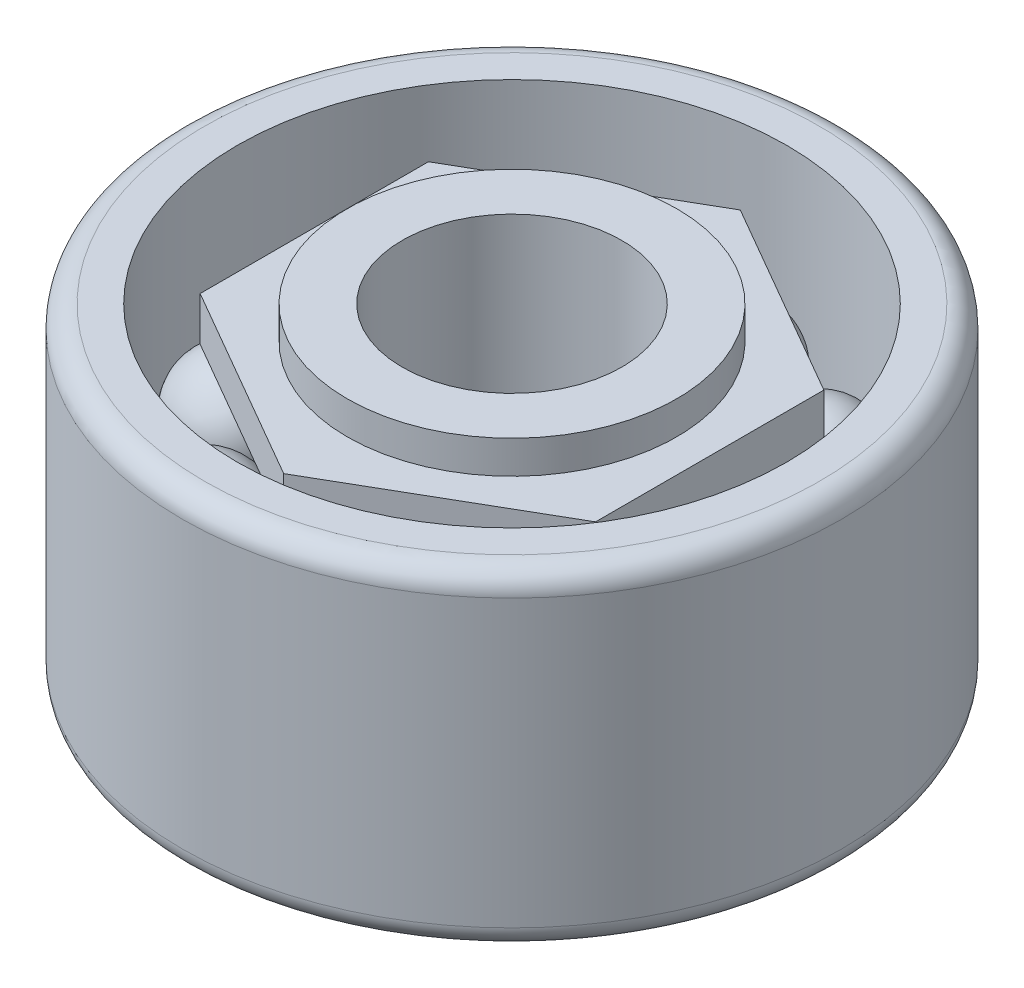
ISO-10303-21;
HEADER;
FILE_DESCRIPTION(('STEP AP214'),'2;1');
FILE_NAME('part.step','',(''),(''),'','','');
FILE_SCHEMA(('AUTOMOTIVE_DESIGN { 1 0 10303 214 1 1 1 1 }'));
ENDSEC;
DATA;
#1=APPLICATION_CONTEXT('core data for automotive mechanical design processes');
#2=APPLICATION_PROTOCOL_DEFINITION('international standard','automotive_design',2000,#1);
#3=PRODUCT_CONTEXT('',#1,'mechanical');
#4=PRODUCT('Part','Part','',(#3));
#5=PRODUCT_RELATED_PRODUCT_CATEGORY('part','',(#4));
#6=PRODUCT_DEFINITION_FORMATION('','',#4);
#7=PRODUCT_DEFINITION_CONTEXT('part definition',#1,'design');
#8=PRODUCT_DEFINITION('design','',#6,#7);
#9=PRODUCT_DEFINITION_SHAPE('','',#8);
#10=(LENGTH_UNIT() NAMED_UNIT(*) SI_UNIT(.MILLI.,.METRE.));
#11=(NAMED_UNIT(*) PLANE_ANGLE_UNIT() SI_UNIT($,.RADIAN.));
#12=(NAMED_UNIT(*) SI_UNIT($,.STERADIAN.) SOLID_ANGLE_UNIT());
#13=UNCERTAINTY_MEASURE_WITH_UNIT(LENGTH_MEASURE(1.E-05),#10,'distance_accuracy_value','');
#14=(GEOMETRIC_REPRESENTATION_CONTEXT(3) GLOBAL_UNCERTAINTY_ASSIGNED_CONTEXT((#13)) GLOBAL_UNIT_ASSIGNED_CONTEXT((#10,
#11,#12)) REPRESENTATION_CONTEXT('',''));
#15=CARTESIAN_POINT('',(0.,0.,0.));
#16=DIRECTION('',(0.,0.,1.));
#17=DIRECTION('',(1.,0.,0.));
#18=AXIS2_PLACEMENT_3D('',#15,#16,#17);
#19=CARTESIAN_POINT('',(-0.587785252292471,0.,-0.809016994374967));
#20=DIRECTION('',(0.587785252292462,0.,0.809016994374955));
#21=DIRECTION('',(0.,1.,0.));
#22=AXIS2_PLACEMENT_3D('',#19,#20,#21);
#23=SPHERICAL_SURFACE('',#22,0.249999999999986);
#24=CARTESIAN_POINT('',(-0.440838939219364,0.,-0.606762745781239));
#25=VERTEX_POINT('',#24);
#26=VERTEX_LOOP('',#25);
#27=FACE_BOUND('',#26,.T.);
#28=ADVANCED_FACE('F47',(#27),#23,.T.);
#29=CLOSED_SHELL('',(#28));
#30=MANIFOLD_SOLID_BREP('B2',#29);
#31=CARTESIAN_POINT('',(-0.951056516295164,0.,-0.309016994374963));
#32=DIRECTION('',(0.95105651629515,0.,0.309016994374958));
#33=DIRECTION('',(0.,1.,0.));
#34=AXIS2_PLACEMENT_3D('',#31,#32,#33);
#35=SPHERICAL_SURFACE('',#34,0.249999999999986);
#36=CARTESIAN_POINT('',(-0.71329238722139,0.,-0.231762745781227));
#37=VERTEX_POINT('',#36);
#38=VERTEX_LOOP('',#37);
#39=FACE_BOUND('',#38,.T.);
#40=ADVANCED_FACE('F65',(#39),#35,.T.);
#41=CLOSED_SHELL('',(#40));
#42=MANIFOLD_SOLID_BREP('B7',#41);
#43=CARTESIAN_POINT('',(-0.95105651629517,0.,0.309016994374943));
#44=DIRECTION('',(0.951056516295157,0.,-0.309016994374938));
#45=DIRECTION('',(0.,1.,0.));
#46=AXIS2_PLACEMENT_3D('',#43,#44,#45);
#47=SPHERICAL_SURFACE('',#46,0.249999999999986);
#48=CARTESIAN_POINT('',(-0.713292387221395,0.,0.231762745781213));
#49=VERTEX_POINT('',#48);
#50=VERTEX_LOOP('',#49);
#51=FACE_BOUND('',#50,.T.);
#52=ADVANCED_FACE('F83',(#51),#47,.T.);
#53=CLOSED_SHELL('',(#52));
#54=MANIFOLD_SOLID_BREP('B43',#53);
#55=CARTESIAN_POINT('',(-0.587785252292489,0.,0.809016994374954));
#56=DIRECTION('',(0.58778525229248,0.,-0.809016994374942));
#57=DIRECTION('',(0.,1.,0.));
#58=AXIS2_PLACEMENT_3D('',#55,#56,#57);
#59=SPHERICAL_SURFACE('',#58,0.249999999999986);
#60=CARTESIAN_POINT('',(-0.440838939219377,0.,0.60676274578123));
#61=VERTEX_POINT('',#60);
#62=VERTEX_LOOP('',#61);
#63=FACE_BOUND('',#62,.T.);
#64=ADVANCED_FACE('F101',(#63),#59,.T.);
#65=CLOSED_SHELL('',(#64));
#66=MANIFOLD_SOLID_BREP('B61',#65);
#67=CARTESIAN_POINT('',(0.,0.,1.00000000000001));
#68=DIRECTION('',(0.,0.,-1.));
#69=DIRECTION('',(0.,1.,0.));
#70=AXIS2_PLACEMENT_3D('',#67,#68,#69);
#71=SPHERICAL_SURFACE('',#70,0.249999999999986);
#72=CARTESIAN_POINT('',(0.,0.,0.750000000000029));
#73=VERTEX_POINT('',#72);
#74=VERTEX_LOOP('',#73);
#75=FACE_BOUND('',#74,.T.);
#76=ADVANCED_FACE('F119',(#75),#71,.T.);
#77=CLOSED_SHELL('',(#76));
#78=MANIFOLD_SOLID_BREP('B79',#77);
#79=CARTESIAN_POINT('',(0.587785252292477,0.,0.809016994374962));
#80=DIRECTION('',(-0.587785252292469,0.,-0.809016994374951));
#81=DIRECTION('',(0.,1.,0.));
#82=AXIS2_PLACEMENT_3D('',#79,#80,#81);
#83=SPHERICAL_SURFACE('',#82,0.249999999999986);
#84=CARTESIAN_POINT('',(0.440838939219368,0.,0.606762745781236));
#85=VERTEX_POINT('',#84);
#86=VERTEX_LOOP('',#85);
#87=FACE_BOUND('',#86,.T.);
#88=ADVANCED_FACE('F137',(#87),#83,.T.);
#89=CLOSED_SHELL('',(#88));
#90=MANIFOLD_SOLID_BREP('B97',#89);
#91=CARTESIAN_POINT('',(0.951056516295166,0.,0.309016994374956));
#92=DIRECTION('',(-0.951056516295152,0.,-0.309016994374952));
#93=DIRECTION('',(0.,1.,0.));
#94=AXIS2_PLACEMENT_3D('',#91,#92,#93);
#95=SPHERICAL_SURFACE('',#94,0.249999999999986);
#96=CARTESIAN_POINT('',(0.713292387221391,0.,0.231762745781223));
#97=VERTEX_POINT('',#96);
#98=VERTEX_LOOP('',#97);
#99=FACE_BOUND('',#98,.T.);
#100=ADVANCED_FACE('F155',(#99),#95,.T.);
#101=CLOSED_SHELL('',(#100));
#102=MANIFOLD_SOLID_BREP('B115',#101);
#103=CARTESIAN_POINT('',(0.951056516295168,0.,-0.309016994374949));
#104=DIRECTION('',(-0.951056516295155,0.,0.309016994374945));
#105=DIRECTION('',(0.,1.,0.));
#106=AXIS2_PLACEMENT_3D('',#103,#104,#105);
#107=SPHERICAL_SURFACE('',#106,0.249999999999986);
#108=CARTESIAN_POINT('',(0.713292387221393,0.,-0.231762745781217));
#109=VERTEX_POINT('',#108);
#110=VERTEX_LOOP('',#109);
#111=FACE_BOUND('',#110,.T.);
#112=ADVANCED_FACE('F173',(#111),#107,.T.);
#113=CLOSED_SHELL('',(#112));
#114=MANIFOLD_SOLID_BREP('B133',#113);
#115=CARTESIAN_POINT('',(0.587785252292483,0.,-0.809016994374958));
#116=DIRECTION('',(-0.587785252292474,0.,0.809016994374947));
#117=DIRECTION('',(0.,1.,0.));
#118=AXIS2_PLACEMENT_3D('',#115,#116,#117);
#119=SPHERICAL_SURFACE('',#118,0.249999999999986);
#120=CARTESIAN_POINT('',(0.440838939219373,0.,-0.606762745781233));
#121=VERTEX_POINT('',#120);
#122=VERTEX_LOOP('',#121);
#123=FACE_BOUND('',#122,.T.);
#124=ADVANCED_FACE('F191',(#123),#119,.T.);
#125=CLOSED_SHELL('',(#124));
#126=MANIFOLD_SOLID_BREP('B151',#125);
#127=CARTESIAN_POINT('',(0.,0.,-1.00000000000001));
#128=DIRECTION('',(0.,0.,1.));
#129=DIRECTION('',(0.,1.,0.));
#130=AXIS2_PLACEMENT_3D('',#127,#128,#129);
#131=SPHERICAL_SURFACE('',#130,0.249999999999986);
#132=CARTESIAN_POINT('',(0.,0.,-0.750000000000029));
#133=VERTEX_POINT('',#132);
#134=VERTEX_LOOP('',#133);
#135=FACE_BOUND('',#134,.T.);
#136=ADVANCED_FACE('F211',(#135),#131,.T.);
#137=CLOSED_SHELL('',(#136));
#138=MANIFOLD_SOLID_BREP('B169',#137);
#139=CARTESIAN_POINT('',(0.,0.75,0.));
#140=DIRECTION('',(0.,-1.,0.));
#141=DIRECTION('',(0.,0.,-1.));
#142=AXIS2_PLACEMENT_3D('',#139,#140,#141);
#143=CYLINDRICAL_SURFACE('',#142,1.25);
#144=CARTESIAN_POINT('',(0.,0.75,0.));
#145=DIRECTION('',(0.,1.,0.));
#146=DIRECTION('',(0.,0.,1.));
#147=AXIS2_PLACEMENT_3D('',#144,#145,#146);
#148=CIRCLE('',#147,1.25);
#149=CARTESIAN_POINT('',(0.,0.75,1.25));
#150=VERTEX_POINT('',#149);
#151=EDGE_CURVE('E253',#150,#150,#148,.T.);
#152=ORIENTED_EDGE('',*,*,#151,.T.);
#153=EDGE_LOOP('',(#152));
#154=FACE_BOUND('',#153,.T.);
#155=CARTESIAN_POINT('',(0.,-0.75,0.));
#156=DIRECTION('',(0.,1.,0.));
#157=DIRECTION('',(0.,0.,1.));
#158=AXIS2_PLACEMENT_3D('',#155,#156,#157);
#159=CIRCLE('',#158,1.25);
#160=CARTESIAN_POINT('',(0.,-0.75,1.25));
#161=VERTEX_POINT('',#160);
#162=EDGE_CURVE('E254',#161,#161,#159,.T.);
#163=ORIENTED_EDGE('',*,*,#162,.F.);
#164=EDGE_LOOP('',(#163));
#165=FACE_BOUND('',#164,.T.);
#166=ADVANCED_FACE('F233',(#154,#165),#143,.F.);
#167=CARTESIAN_POINT('',(0.,0.75,0.));
#168=DIRECTION('',(0.,-1.,0.));
#169=DIRECTION('',(0.,0.,-1.));
#170=AXIS2_PLACEMENT_3D('',#167,#168,#169);
#171=CYLINDRICAL_SURFACE('',#170,1.5);
#172=CARTESIAN_POINT('',(0.,-0.65,0.));
#173=DIRECTION('',(0.,1.,0.));
#174=DIRECTION('',(0.,0.,1.));
#175=AXIS2_PLACEMENT_3D('',#172,#173,#174);
#176=CIRCLE('',#175,1.5);
#177=CARTESIAN_POINT('',(0.,-0.65,1.5));
#178=VERTEX_POINT('',#177);
#179=EDGE_CURVE('E244',#178,#178,#176,.T.);
#180=ORIENTED_EDGE('',*,*,#179,.T.);
#181=EDGE_LOOP('',(#180));
#182=FACE_BOUND('',#181,.T.);
#183=CARTESIAN_POINT('',(0.,0.65,0.));
#184=DIRECTION('',(0.,1.,0.));
#185=DIRECTION('',(0.,0.,1.));
#186=AXIS2_PLACEMENT_3D('',#183,#184,#185);
#187=CIRCLE('',#186,1.5);
#188=CARTESIAN_POINT('',(0.,0.65,1.5));
#189=VERTEX_POINT('',#188);
#190=EDGE_CURVE('E248',#189,#189,#187,.F.);
#191=ORIENTED_EDGE('',*,*,#190,.T.);
#192=EDGE_LOOP('',(#191));
#193=FACE_BOUND('',#192,.T.);
#194=ADVANCED_FACE('F265',(#182,#193),#171,.T.);
#195=CARTESIAN_POINT('',(0.,0.75,0.));
#196=DIRECTION('',(0.,1.,0.));
#197=DIRECTION('',(0.,0.,1.));
#198=AXIS2_PLACEMENT_3D('',#195,#196,#197);
#199=PLANE('',#198);
#200=CARTESIAN_POINT('',(0.,0.75,0.));
#201=DIRECTION('',(0.,1.,0.));
#202=DIRECTION('',(0.,0.,1.));
#203=AXIS2_PLACEMENT_3D('',#200,#201,#202);
#204=CIRCLE('',#203,1.4);
#205=CARTESIAN_POINT('',(0.,0.75,1.4));
#206=VERTEX_POINT('',#205);
#207=EDGE_CURVE('E210',#206,#206,#204,.T.);
#208=ORIENTED_EDGE('',*,*,#207,.T.);
#209=EDGE_LOOP('',(#208));
#210=FACE_BOUND('',#209,.T.);
#211=ORIENTED_EDGE('',*,*,#151,.F.);
#212=EDGE_LOOP('',(#211));
#213=FACE_BOUND('',#212,.T.);
#214=ADVANCED_FACE('F262',(#210,#213),#199,.T.);
#215=CARTESIAN_POINT('',(0.,-0.75,0.));
#216=DIRECTION('',(0.,1.,0.));
#217=DIRECTION('',(0.,0.,1.));
#218=AXIS2_PLACEMENT_3D('',#215,#216,#217);
#219=PLANE('',#218);
#220=CARTESIAN_POINT('',(0.,-0.75,0.));
#221=DIRECTION('',(0.,1.,0.));
#222=DIRECTION('',(0.,0.,1.));
#223=AXIS2_PLACEMENT_3D('',#220,#221,#222);
#224=CIRCLE('',#223,1.4);
#225=CARTESIAN_POINT('',(0.,-0.75,1.4));
#226=VERTEX_POINT('',#225);
#227=EDGE_CURVE('E240',#226,#226,#224,.F.);
#228=ORIENTED_EDGE('',*,*,#227,.T.);
#229=EDGE_LOOP('',(#228));
#230=FACE_BOUND('',#229,.T.);
#231=ORIENTED_EDGE('',*,*,#162,.T.);
#232=EDGE_LOOP('',(#231));
#233=FACE_BOUND('',#232,.T.);
#234=ADVANCED_FACE('F264',(#230,#233),#219,.F.);
#235=CARTESIAN_POINT('',(0.,-0.65,0.));
#236=DIRECTION('',(0.,1.,0.));
#237=DIRECTION('',(0.,0.,1.));
#238=AXIS2_PLACEMENT_3D('',#235,#236,#237);
#239=TOROIDAL_SURFACE('',#238,1.4,0.1);
#240=ORIENTED_EDGE('',*,*,#227,.F.);
#241=EDGE_LOOP('',(#240));
#242=FACE_BOUND('',#241,.T.);
#243=ORIENTED_EDGE('',*,*,#179,.F.);
#244=EDGE_LOOP('',(#243));
#245=FACE_BOUND('',#244,.T.);
#246=ADVANCED_FACE('F271',(#242,#245),#239,.T.);
#247=CARTESIAN_POINT('',(0.,0.65,0.));
#248=DIRECTION('',(0.,1.,0.));
#249=DIRECTION('',(0.,0.,1.));
#250=AXIS2_PLACEMENT_3D('',#247,#248,#249);
#251=TOROIDAL_SURFACE('',#250,1.4,0.1);
#252=ORIENTED_EDGE('',*,*,#190,.F.);
#253=EDGE_LOOP('',(#252));
#254=FACE_BOUND('',#253,.T.);
#255=ORIENTED_EDGE('',*,*,#207,.F.);
#256=EDGE_LOOP('',(#255));
#257=FACE_BOUND('',#256,.T.);
#258=ADVANCED_FACE('F235',(#254,#257),#251,.T.);
#259=CLOSED_SHELL('',(#166,#194,#214,#234,#246,#258));
#260=MANIFOLD_SOLID_BREP('B187',#259);
#261=CARTESIAN_POINT('',(0.,0.75,0.));
#262=DIRECTION('',(0.,-1.,0.));
#263=DIRECTION('',(0.,0.,-1.));
#264=AXIS2_PLACEMENT_3D('',#261,#262,#263);
#265=CYLINDRICAL_SURFACE('',#264,0.75);
#266=CARTESIAN_POINT('',(0.,-0.75,0.));
#267=DIRECTION('',(0.,1.,0.));
#268=DIRECTION('',(0.,0.,1.));
#269=AXIS2_PLACEMENT_3D('',#266,#267,#268);
#270=CIRCLE('',#269,0.75);
#271=CARTESIAN_POINT('',(0.,-0.75,0.75));
#272=VERTEX_POINT('',#271);
#273=EDGE_CURVE('E439',#272,#272,#270,.T.);
#274=ORIENTED_EDGE('',*,*,#273,.T.);
#275=EDGE_LOOP('',(#274));
#276=FACE_BOUND('',#275,.T.);
#277=CARTESIAN_POINT('',(0.,-0.6,0.));
#278=DIRECTION('',(0.,1.,0.));
#279=DIRECTION('',(0.,0.,1.));
#280=AXIS2_PLACEMENT_3D('',#277,#278,#279);
#281=CIRCLE('',#280,0.75);
#282=CARTESIAN_POINT('',(0.,-0.6,0.75));
#283=VERTEX_POINT('',#282);
#284=EDGE_CURVE('E231',#283,#283,#281,.T.);
#285=ORIENTED_EDGE('',*,*,#284,.F.);
#286=EDGE_LOOP('',(#285));
#287=FACE_BOUND('',#286,.T.);
#288=ADVANCED_FACE('F324',(#276,#287),#265,.T.);
#289=CARTESIAN_POINT('',(0.,-0.4,0.));
#290=DIRECTION('',(0.,1.,0.));
#291=DIRECTION('',(0.,0.,1.));
#292=AXIS2_PLACEMENT_3D('',#289,#290,#291);
#293=CIRCLE('',#292,0.75);
#294=CARTESIAN_POINT('',(0.,-0.4,0.75));
#295=VERTEX_POINT('',#294);
#296=EDGE_CURVE('E563',#295,#295,#293,.T.);
#297=ORIENTED_EDGE('',*,*,#296,.T.);
#298=EDGE_LOOP('',(#297));
#299=FACE_BOUND('',#298,.T.);
#300=CARTESIAN_POINT('',(0.,0.4,0.));
#301=DIRECTION('',(0.,1.,0.));
#302=DIRECTION('',(0.,0.,1.));
#303=AXIS2_PLACEMENT_3D('',#300,#301,#302);
#304=CIRCLE('',#303,0.75);
#305=CARTESIAN_POINT('',(0.,0.4,0.75));
#306=VERTEX_POINT('',#305);
#307=EDGE_CURVE('E333',#306,#306,#304,.T.);
#308=ORIENTED_EDGE('',*,*,#307,.F.);
#309=EDGE_LOOP('',(#308));
#310=FACE_BOUND('',#309,.T.);
#311=ADVANCED_FACE('F451',(#299,#310),#265,.T.);
#312=CARTESIAN_POINT('',(0.,0.75,0.));
#313=DIRECTION('',(0.,-1.,0.));
#314=DIRECTION('',(0.,0.,-1.));
#315=AXIS2_PLACEMENT_3D('',#312,#313,#314);
#316=CYLINDRICAL_SURFACE('',#315,0.5);
#317=CARTESIAN_POINT('',(0.,0.75,0.));
#318=DIRECTION('',(0.,1.,0.));
#319=DIRECTION('',(0.,0.,1.));
#320=AXIS2_PLACEMENT_3D('',#317,#318,#319);
#321=CIRCLE('',#320,0.5);
#322=CARTESIAN_POINT('',(0.,0.75,0.5));
#323=VERTEX_POINT('',#322);
#324=EDGE_CURVE('E435',#323,#323,#321,.T.);
#325=ORIENTED_EDGE('',*,*,#324,.T.);
#326=EDGE_LOOP('',(#325));
#327=FACE_BOUND('',#326,.T.);
#328=CARTESIAN_POINT('',(0.,-0.75,0.));
#329=DIRECTION('',(0.,1.,0.));
#330=DIRECTION('',(0.,0.,1.));
#331=AXIS2_PLACEMENT_3D('',#328,#329,#330);
#332=CIRCLE('',#331,0.5);
#333=CARTESIAN_POINT('',(0.,-0.75,0.5));
#334=VERTEX_POINT('',#333);
#335=EDGE_CURVE('E434',#334,#334,#332,.T.);
#336=ORIENTED_EDGE('',*,*,#335,.F.);
#337=EDGE_LOOP('',(#336));
#338=FACE_BOUND('',#337,.T.);
#339=ADVANCED_FACE('F326',(#327,#338),#316,.F.);
#340=CARTESIAN_POINT('',(0.,0.6,0.));
#341=DIRECTION('',(0.,1.,0.));
#342=DIRECTION('',(0.,0.,1.));
#343=AXIS2_PLACEMENT_3D('',#340,#341,#342);
#344=CIRCLE('',#343,0.75);
#345=CARTESIAN_POINT('',(0.,0.6,0.75));
#346=VERTEX_POINT('',#345);
#347=EDGE_CURVE('E425',#346,#346,#344,.T.);
#348=ORIENTED_EDGE('',*,*,#347,.T.);
#349=EDGE_LOOP('',(#348));
#350=FACE_BOUND('',#349,.T.);
#351=CARTESIAN_POINT('',(0.,0.75,0.));
#352=DIRECTION('',(0.,1.,0.));
#353=DIRECTION('',(0.,0.,1.));
#354=AXIS2_PLACEMENT_3D('',#351,#352,#353);
#355=CIRCLE('',#354,0.75);
#356=CARTESIAN_POINT('',(0.,0.75,0.75));
#357=VERTEX_POINT('',#356);
#358=EDGE_CURVE('E438',#357,#357,#355,.T.);
#359=ORIENTED_EDGE('',*,*,#358,.F.);
#360=EDGE_LOOP('',(#359));
#361=FACE_BOUND('',#360,.T.);
#362=ADVANCED_FACE('F454',(#350,#361),#265,.T.);
#363=CARTESIAN_POINT('',(0.,0.75,0.));
#364=DIRECTION('',(0.,1.,0.));
#365=DIRECTION('',(0.,0.,1.));
#366=AXIS2_PLACEMENT_3D('',#363,#364,#365);
#367=PLANE('',#366);
#368=ORIENTED_EDGE('',*,*,#324,.F.);
#369=EDGE_LOOP('',(#368));
#370=FACE_BOUND('',#369,.T.);
#371=ORIENTED_EDGE('',*,*,#358,.T.);
#372=EDGE_LOOP('',(#371));
#373=FACE_BOUND('',#372,.T.);
#374=ADVANCED_FACE('F464',(#370,#373),#367,.T.);
#375=CARTESIAN_POINT('',(0.,-0.75,0.));
#376=DIRECTION('',(0.,1.,0.));
#377=DIRECTION('',(0.,0.,1.));
#378=AXIS2_PLACEMENT_3D('',#375,#376,#377);
#379=PLANE('',#378);
#380=ORIENTED_EDGE('',*,*,#335,.T.);
#381=EDGE_LOOP('',(#380));
#382=FACE_BOUND('',#381,.T.);
#383=ORIENTED_EDGE('',*,*,#273,.F.);
#384=EDGE_LOOP('',(#383));
#385=FACE_BOUND('',#384,.T.);
#386=ADVANCED_FACE('F469',(#382,#385),#379,.F.);
#387=CARTESIAN_POINT('',(0.45,0.6,-0.779422863405995));
#388=DIRECTION('',(-0.5,0.,0.866025403784439));
#389=DIRECTION('',(0.866025403784439,0.,0.5));
#390=AXIS2_PLACEMENT_3D('',#387,#388,#389);
#391=PLANE('',#390);
#392=DIRECTION('',(-0.866025403784439,0.,-0.5));
#393=VECTOR('',#392,1.);
#394=CARTESIAN_POINT('',(0.45,0.4,-0.779422863405995));
#395=LINE('',#394,#393);
#396=CARTESIAN_POINT('',(0.9,0.4,-0.519615242270664));
#397=VERTEX_POINT('',#396);
#398=CARTESIAN_POINT('',(0.,0.4,-1.03923048454133));
#399=VERTEX_POINT('',#398);
#400=EDGE_CURVE('E414',#397,#399,#395,.T.);
#401=ORIENTED_EDGE('',*,*,#400,.T.);
#402=DIRECTION('',(0.,-1.,0.));
#403=VECTOR('',#402,1.);
#404=CARTESIAN_POINT('',(0.,0.6,-1.03923048454133));
#405=LINE('',#404,#403);
#406=CARTESIAN_POINT('',(0.,0.6,-1.03923048454133));
#407=VERTEX_POINT('',#406);
#408=EDGE_CURVE('E432',#407,#399,#405,.T.);
#409=ORIENTED_EDGE('',*,*,#408,.F.);
#410=DIRECTION('',(-0.866025403784439,0.,-0.5));
#411=VECTOR('',#410,1.);
#412=CARTESIAN_POINT('',(0.45,0.6,-0.779422863405995));
#413=LINE('',#412,#411);
#414=CARTESIAN_POINT('',(0.9,0.6,-0.519615242270664));
#415=VERTEX_POINT('',#414);
#416=EDGE_CURVE('E478',#415,#407,#413,.T.);
#417=ORIENTED_EDGE('',*,*,#416,.F.);
#418=DIRECTION('',(0.,-1.,0.));
#419=VECTOR('',#418,1.);
#420=CARTESIAN_POINT('',(0.9,0.6,-0.519615242270664));
#421=LINE('',#420,#419);
#422=EDGE_CURVE('E410',#415,#397,#421,.T.);
#423=ORIENTED_EDGE('',*,*,#422,.T.);
#424=EDGE_LOOP('',(#401,#409,#417,#423));
#425=FACE_BOUND('',#424,.T.);
#426=ADVANCED_FACE('F493',(#425),#391,.F.);
#427=CARTESIAN_POINT('',(-0.45,0.6,-0.779422863405995));
#428=DIRECTION('',(0.5,0.,0.866025403784438));
#429=DIRECTION('',(0.866025403784438,0.,-0.5));
#430=AXIS2_PLACEMENT_3D('',#427,#428,#429);
#431=PLANE('',#430);
#432=DIRECTION('',(-0.866025403784438,0.,0.5));
#433=VECTOR('',#432,1.);
#434=CARTESIAN_POINT('',(-0.45,0.4,-0.779422863405995));
#435=LINE('',#434,#433);
#436=CARTESIAN_POINT('',(-0.9,0.4,-0.519615242270663));
#437=VERTEX_POINT('',#436);
#438=EDGE_CURVE('E417',#399,#437,#435,.T.);
#439=ORIENTED_EDGE('',*,*,#438,.T.);
#440=DIRECTION('',(0.,-1.,0.));
#441=VECTOR('',#440,1.);
#442=CARTESIAN_POINT('',(-0.9,0.6,-0.519615242270663));
#443=LINE('',#442,#441);
#444=CARTESIAN_POINT('',(-0.9,0.6,-0.519615242270663));
#445=VERTEX_POINT('',#444);
#446=EDGE_CURVE('E429',#445,#437,#443,.T.);
#447=ORIENTED_EDGE('',*,*,#446,.F.);
#448=DIRECTION('',(-0.866025403784438,0.,0.5));
#449=VECTOR('',#448,1.);
#450=CARTESIAN_POINT('',(-0.45,0.6,-0.779422863405995));
#451=LINE('',#450,#449);
#452=EDGE_CURVE('E380',#407,#445,#451,.T.);
#453=ORIENTED_EDGE('',*,*,#452,.F.);
#454=ORIENTED_EDGE('',*,*,#408,.T.);
#455=EDGE_LOOP('',(#439,#447,#453,#454));
#456=FACE_BOUND('',#455,.T.);
#457=ADVANCED_FACE('F487',(#456),#431,.F.);
#458=CARTESIAN_POINT('',(-0.9,0.6,0.));
#459=DIRECTION('',(1.,0.,0.));
#460=DIRECTION('',(0.,0.,-1.));
#461=AXIS2_PLACEMENT_3D('',#458,#459,#460);
#462=PLANE('',#461);
#463=DIRECTION('',(0.,0.,1.));
#464=VECTOR('',#463,1.);
#465=CARTESIAN_POINT('',(-0.9,0.4,0.));
#466=LINE('',#465,#464);
#467=CARTESIAN_POINT('',(-0.9,0.4,0.519615242270663));
#468=VERTEX_POINT('',#467);
#469=EDGE_CURVE('E420',#437,#468,#466,.T.);
#470=ORIENTED_EDGE('',*,*,#469,.T.);
#471=DIRECTION('',(0.,-1.,0.));
#472=VECTOR('',#471,1.);
#473=CARTESIAN_POINT('',(-0.9,0.6,0.519615242270663));
#474=LINE('',#473,#472);
#475=CARTESIAN_POINT('',(-0.9,0.6,0.519615242270663));
#476=VERTEX_POINT('',#475);
#477=EDGE_CURVE('E405',#476,#468,#474,.T.);
#478=ORIENTED_EDGE('',*,*,#477,.F.);
#479=DIRECTION('',(0.,0.,1.));
#480=VECTOR('',#479,1.);
#481=CARTESIAN_POINT('',(-0.9,0.6,0.));
#482=LINE('',#481,#480);
#483=EDGE_CURVE('E396',#445,#476,#482,.T.);
#484=ORIENTED_EDGE('',*,*,#483,.F.);
#485=ORIENTED_EDGE('',*,*,#446,.T.);
#486=EDGE_LOOP('',(#470,#478,#484,#485));
#487=FACE_BOUND('',#486,.T.);
#488=ADVANCED_FACE('F490',(#487),#462,.F.);
#489=CARTESIAN_POINT('',(-0.45,0.6,0.779422863405995));
#490=DIRECTION('',(0.5,0.,-0.866025403784439));
#491=DIRECTION('',(-0.866025403784439,0.,-0.5));
#492=AXIS2_PLACEMENT_3D('',#489,#490,#491);
#493=PLANE('',#492);
#494=DIRECTION('',(0.866025403784439,0.,0.5));
#495=VECTOR('',#494,1.);
#496=CARTESIAN_POINT('',(-0.45,0.4,0.779422863405995));
#497=LINE('',#496,#495);
#498=CARTESIAN_POINT('',(0.,0.4,1.03923048454133));
#499=VERTEX_POINT('',#498);
#500=EDGE_CURVE('E404',#468,#499,#497,.T.);
#501=ORIENTED_EDGE('',*,*,#500,.T.);
#502=DIRECTION('',(0.,-1.,0.));
#503=VECTOR('',#502,1.);
#504=CARTESIAN_POINT('',(0.,0.6,1.03923048454133));
#505=LINE('',#504,#503);
#506=CARTESIAN_POINT('',(0.,0.6,1.03923048454133));
#507=VERTEX_POINT('',#506);
#508=EDGE_CURVE('E401',#507,#499,#505,.T.);
#509=ORIENTED_EDGE('',*,*,#508,.F.);
#510=DIRECTION('',(0.866025403784439,0.,0.5));
#511=VECTOR('',#510,1.);
#512=CARTESIAN_POINT('',(-0.45,0.6,0.779422863405995));
#513=LINE('',#512,#511);
#514=EDGE_CURVE('E390',#476,#507,#513,.T.);
#515=ORIENTED_EDGE('',*,*,#514,.F.);
#516=ORIENTED_EDGE('',*,*,#477,.T.);
#517=EDGE_LOOP('',(#501,#509,#515,#516));
#518=FACE_BOUND('',#517,.T.);
#519=ADVANCED_FACE('F402',(#518),#493,.F.);
#520=CARTESIAN_POINT('',(0.45,0.6,0.779422863405995));
#521=DIRECTION('',(-0.5,0.,-0.866025403784439));
#522=DIRECTION('',(-0.866025403784439,0.,0.5));
#523=AXIS2_PLACEMENT_3D('',#520,#521,#522);
#524=PLANE('',#523);
#525=DIRECTION('',(0.866025403784439,0.,-0.5));
#526=VECTOR('',#525,1.);
#527=CARTESIAN_POINT('',(0.45,0.4,0.779422863405995));
#528=LINE('',#527,#526);
#529=CARTESIAN_POINT('',(0.9,0.4,0.519615242270663));
#530=VERTEX_POINT('',#529);
#531=EDGE_CURVE('E365',#499,#530,#528,.T.);
#532=ORIENTED_EDGE('',*,*,#531,.T.);
#533=DIRECTION('',(0.,-1.,0.));
#534=VECTOR('',#533,1.);
#535=CARTESIAN_POINT('',(0.9,0.6,0.519615242270663));
#536=LINE('',#535,#534);
#537=CARTESIAN_POINT('',(0.9,0.6,0.519615242270663));
#538=VERTEX_POINT('',#537);
#539=EDGE_CURVE('E406',#538,#530,#536,.T.);
#540=ORIENTED_EDGE('',*,*,#539,.F.);
#541=DIRECTION('',(0.866025403784439,0.,-0.5));
#542=VECTOR('',#541,1.);
#543=CARTESIAN_POINT('',(0.45,0.6,0.779422863405995));
#544=LINE('',#543,#542);
#545=EDGE_CURVE('E394',#507,#538,#544,.T.);
#546=ORIENTED_EDGE('',*,*,#545,.F.);
#547=ORIENTED_EDGE('',*,*,#508,.T.);
#548=EDGE_LOOP('',(#532,#540,#546,#547));
#549=FACE_BOUND('',#548,.T.);
#550=ADVANCED_FACE('F408',(#549),#524,.F.);
#551=CARTESIAN_POINT('',(0.9,0.6,0.));
#552=DIRECTION('',(-1.,0.,0.));
#553=DIRECTION('',(0.,0.,1.));
#554=AXIS2_PLACEMENT_3D('',#551,#552,#553);
#555=PLANE('',#554);
#556=DIRECTION('',(0.,0.,-1.));
#557=VECTOR('',#556,1.);
#558=CARTESIAN_POINT('',(0.9,0.4,0.));
#559=LINE('',#558,#557);
#560=EDGE_CURVE('E371',#530,#397,#559,.T.);
#561=ORIENTED_EDGE('',*,*,#560,.T.);
#562=ORIENTED_EDGE('',*,*,#422,.F.);
#563=DIRECTION('',(0.,0.,-1.));
#564=VECTOR('',#563,1.);
#565=CARTESIAN_POINT('',(0.9,0.6,0.));
#566=LINE('',#565,#564);
#567=EDGE_CURVE('E341',#538,#415,#566,.T.);
#568=ORIENTED_EDGE('',*,*,#567,.F.);
#569=ORIENTED_EDGE('',*,*,#539,.T.);
#570=EDGE_LOOP('',(#561,#562,#568,#569));
#571=FACE_BOUND('',#570,.T.);
#572=ADVANCED_FACE('F494',(#571),#555,.F.);
#573=CARTESIAN_POINT('',(0.,0.6,0.));
#574=DIRECTION('',(0.,1.,0.));
#575=DIRECTION('',(0.,0.,1.));
#576=AXIS2_PLACEMENT_3D('',#573,#574,#575);
#577=PLANE('',#576);
#578=ORIENTED_EDGE('',*,*,#347,.F.);
#579=EDGE_LOOP('',(#578));
#580=FACE_BOUND('',#579,.T.);
#581=ORIENTED_EDGE('',*,*,#416,.T.);
#582=ORIENTED_EDGE('',*,*,#452,.T.);
#583=ORIENTED_EDGE('',*,*,#483,.T.);
#584=ORIENTED_EDGE('',*,*,#514,.T.);
#585=ORIENTED_EDGE('',*,*,#545,.T.);
#586=ORIENTED_EDGE('',*,*,#567,.T.);
#587=EDGE_LOOP('',(#581,#582,#583,#584,#585,#586));
#588=FACE_BOUND('',#587,.T.);
#589=ADVANCED_FACE('F392',(#580,#588),#577,.T.);
#590=CARTESIAN_POINT('',(0.,0.4,0.));
#591=DIRECTION('',(0.,1.,0.));
#592=DIRECTION('',(0.,0.,1.));
#593=AXIS2_PLACEMENT_3D('',#590,#591,#592);
#594=PLANE('',#593);
#595=ORIENTED_EDGE('',*,*,#307,.T.);
#596=EDGE_LOOP('',(#595));
#597=FACE_BOUND('',#596,.T.);
#598=ORIENTED_EDGE('',*,*,#400,.F.);
#599=ORIENTED_EDGE('',*,*,#560,.F.);
#600=ORIENTED_EDGE('',*,*,#531,.F.);
#601=ORIENTED_EDGE('',*,*,#500,.F.);
#602=ORIENTED_EDGE('',*,*,#469,.F.);
#603=ORIENTED_EDGE('',*,*,#438,.F.);
#604=EDGE_LOOP('',(#598,#599,#600,#601,#602,#603));
#605=FACE_BOUND('',#604,.T.);
#606=ADVANCED_FACE('F448',(#597,#605),#594,.F.);
#607=CARTESIAN_POINT('',(0.45,-0.6,-0.779422863405995));
#608=DIRECTION('',(0.5,0.,-0.866025403784439));
#609=DIRECTION('',(-0.866025403784439,0.,-0.5));
#610=AXIS2_PLACEMENT_3D('',#607,#608,#609);
#611=PLANE('',#610);
#612=DIRECTION('',(-0.866025403784439,0.,-0.5));
#613=VECTOR('',#612,1.);
#614=CARTESIAN_POINT('',(0.45,-0.4,-0.779422863405995));
#615=LINE('',#614,#613);
#616=CARTESIAN_POINT('',(0.9,-0.4,-0.519615242270664));
#617=VERTEX_POINT('',#616);
#618=CARTESIAN_POINT('',(0.,-0.4,-1.03923048454133));
#619=VERTEX_POINT('',#618);
#620=EDGE_CURVE('E565',#617,#619,#615,.T.);
#621=ORIENTED_EDGE('',*,*,#620,.F.);
#622=DIRECTION('',(0.,1.,0.));
#623=VECTOR('',#622,1.);
#624=CARTESIAN_POINT('',(0.9,-0.6,-0.519615242270664));
#625=LINE('',#624,#623);
#626=CARTESIAN_POINT('',(0.9,-0.6,-0.519615242270664));
#627=VERTEX_POINT('',#626);
#628=EDGE_CURVE('E418',#627,#617,#625,.T.);
#629=ORIENTED_EDGE('',*,*,#628,.F.);
#630=DIRECTION('',(-0.866025403784439,0.,-0.5));
#631=VECTOR('',#630,1.);
#632=CARTESIAN_POINT('',(0.45,-0.6,-0.779422863405995));
#633=LINE('',#632,#631);
#634=CARTESIAN_POINT('',(0.,-0.6,-1.03923048454133));
#635=VERTEX_POINT('',#634);
#636=EDGE_CURVE('E532',#627,#635,#633,.T.);
#637=ORIENTED_EDGE('',*,*,#636,.T.);
#638=DIRECTION('',(0.,1.,0.));
#639=VECTOR('',#638,1.);
#640=CARTESIAN_POINT('',(0.,-0.6,-1.03923048454133));
#641=LINE('',#640,#639);
#642=EDGE_CURVE('E482',#635,#619,#641,.T.);
#643=ORIENTED_EDGE('',*,*,#642,.T.);
#644=EDGE_LOOP('',(#621,#629,#637,#643));
#645=FACE_BOUND('',#644,.T.);
#646=ADVANCED_FACE('F607',(#645),#611,.T.);
#647=CARTESIAN_POINT('',(0.9,-0.6,0.));
#648=DIRECTION('',(1.,0.,0.));
#649=DIRECTION('',(0.,0.,-1.));
#650=AXIS2_PLACEMENT_3D('',#647,#648,#649);
#651=PLANE('',#650);
#652=DIRECTION('',(0.,0.,-1.));
#653=VECTOR('',#652,1.);
#654=CARTESIAN_POINT('',(0.9,-0.4,0.));
#655=LINE('',#654,#653);
#656=CARTESIAN_POINT('',(0.9,-0.4,0.519615242270663));
#657=VERTEX_POINT('',#656);
#658=EDGE_CURVE('E545',#657,#617,#655,.T.);
#659=ORIENTED_EDGE('',*,*,#658,.F.);
#660=DIRECTION('',(0.,1.,0.));
#661=VECTOR('',#660,1.);
#662=CARTESIAN_POINT('',(0.9,-0.6,0.519615242270663));
#663=LINE('',#662,#661);
#664=CARTESIAN_POINT('',(0.9,-0.6,0.519615242270663));
#665=VERTEX_POINT('',#664);
#666=EDGE_CURVE('E554',#665,#657,#663,.T.);
#667=ORIENTED_EDGE('',*,*,#666,.F.);
#668=DIRECTION('',(0.,0.,-1.));
#669=VECTOR('',#668,1.);
#670=CARTESIAN_POINT('',(0.9,-0.6,0.));
#671=LINE('',#670,#669);
#672=EDGE_CURVE('E536',#665,#627,#671,.T.);
#673=ORIENTED_EDGE('',*,*,#672,.T.);
#674=ORIENTED_EDGE('',*,*,#628,.T.);
#675=EDGE_LOOP('',(#659,#667,#673,#674));
#676=FACE_BOUND('',#675,.T.);
#677=ADVANCED_FACE('F551',(#676),#651,.T.);
#678=CARTESIAN_POINT('',(0.45,-0.6,0.779422863405995));
#679=DIRECTION('',(0.5,0.,0.866025403784439));
#680=DIRECTION('',(0.866025403784439,0.,-0.5));
#681=AXIS2_PLACEMENT_3D('',#678,#679,#680);
#682=PLANE('',#681);
#683=DIRECTION('',(0.866025403784439,0.,-0.5));
#684=VECTOR('',#683,1.);
#685=CARTESIAN_POINT('',(0.45,-0.4,0.779422863405995));
#686=LINE('',#685,#684);
#687=CARTESIAN_POINT('',(0.,-0.4,1.03923048454133));
#688=VERTEX_POINT('',#687);
#689=EDGE_CURVE('E577',#688,#657,#686,.T.);
#690=ORIENTED_EDGE('',*,*,#689,.F.);
#691=DIRECTION('',(0.,1.,0.));
#692=VECTOR('',#691,1.);
#693=CARTESIAN_POINT('',(0.,-0.6,1.03923048454133));
#694=LINE('',#693,#692);
#695=CARTESIAN_POINT('',(0.,-0.6,1.03923048454133));
#696=VERTEX_POINT('',#695);
#697=EDGE_CURVE('E584',#696,#688,#694,.T.);
#698=ORIENTED_EDGE('',*,*,#697,.F.);
#699=DIRECTION('',(0.866025403784439,0.,-0.5));
#700=VECTOR('',#699,1.);
#701=CARTESIAN_POINT('',(0.45,-0.6,0.779422863405995));
#702=LINE('',#701,#700);
#703=EDGE_CURVE('E556',#696,#665,#702,.T.);
#704=ORIENTED_EDGE('',*,*,#703,.T.);
#705=ORIENTED_EDGE('',*,*,#666,.T.);
#706=EDGE_LOOP('',(#690,#698,#704,#705));
#707=FACE_BOUND('',#706,.T.);
#708=ADVANCED_FACE('F629',(#707),#682,.T.);
#709=CARTESIAN_POINT('',(-0.45,-0.6,0.779422863405995));
#710=DIRECTION('',(-0.5,0.,0.866025403784439));
#711=DIRECTION('',(0.866025403784439,0.,0.5));
#712=AXIS2_PLACEMENT_3D('',#709,#710,#711);
#713=PLANE('',#712);
#714=DIRECTION('',(0.866025403784439,0.,0.5));
#715=VECTOR('',#714,1.);
#716=CARTESIAN_POINT('',(-0.45,-0.4,0.779422863405995));
#717=LINE('',#716,#715);
#718=CARTESIAN_POINT('',(-0.9,-0.4,0.519615242270663));
#719=VERTEX_POINT('',#718);
#720=EDGE_CURVE('E574',#719,#688,#717,.T.);
#721=ORIENTED_EDGE('',*,*,#720,.F.);
#722=DIRECTION('',(0.,1.,0.));
#723=VECTOR('',#722,1.);
#724=CARTESIAN_POINT('',(-0.9,-0.6,0.519615242270663));
#725=LINE('',#724,#723);
#726=CARTESIAN_POINT('',(-0.9,-0.6,0.519615242270663));
#727=VERTEX_POINT('',#726);
#728=EDGE_CURVE('E587',#727,#719,#725,.T.);
#729=ORIENTED_EDGE('',*,*,#728,.F.);
#730=DIRECTION('',(0.866025403784439,0.,0.5));
#731=VECTOR('',#730,1.);
#732=CARTESIAN_POINT('',(-0.45,-0.6,0.779422863405995));
#733=LINE('',#732,#731);
#734=EDGE_CURVE('E559',#727,#696,#733,.T.);
#735=ORIENTED_EDGE('',*,*,#734,.T.);
#736=ORIENTED_EDGE('',*,*,#697,.T.);
#737=EDGE_LOOP('',(#721,#729,#735,#736));
#738=FACE_BOUND('',#737,.T.);
#739=ADVANCED_FACE('F625',(#738),#713,.T.);
#740=CARTESIAN_POINT('',(-0.9,-0.6,0.));
#741=DIRECTION('',(-1.,0.,0.));
#742=DIRECTION('',(0.,0.,1.));
#743=AXIS2_PLACEMENT_3D('',#740,#741,#742);
#744=PLANE('',#743);
#745=DIRECTION('',(0.,0.,1.));
#746=VECTOR('',#745,1.);
#747=CARTESIAN_POINT('',(-0.9,-0.4,0.));
#748=LINE('',#747,#746);
#749=CARTESIAN_POINT('',(-0.9,-0.4,-0.519615242270663));
#750=VERTEX_POINT('',#749);
#751=EDGE_CURVE('E571',#750,#719,#748,.T.);
#752=ORIENTED_EDGE('',*,*,#751,.F.);
#753=DIRECTION('',(0.,1.,0.));
#754=VECTOR('',#753,1.);
#755=CARTESIAN_POINT('',(-0.9,-0.6,-0.519615242270663));
#756=LINE('',#755,#754);
#757=CARTESIAN_POINT('',(-0.9,-0.6,-0.519615242270663));
#758=VERTEX_POINT('',#757);
#759=EDGE_CURVE('E558',#758,#750,#756,.T.);
#760=ORIENTED_EDGE('',*,*,#759,.F.);
#761=DIRECTION('',(0.,0.,1.));
#762=VECTOR('',#761,1.);
#763=CARTESIAN_POINT('',(-0.9,-0.6,0.));
#764=LINE('',#763,#762);
#765=EDGE_CURVE('E626',#758,#727,#764,.T.);
#766=ORIENTED_EDGE('',*,*,#765,.T.);
#767=ORIENTED_EDGE('',*,*,#728,.T.);
#768=EDGE_LOOP('',(#752,#760,#766,#767));
#769=FACE_BOUND('',#768,.T.);
#770=ADVANCED_FACE('F602',(#769),#744,.T.);
#771=CARTESIAN_POINT('',(-0.45,-0.6,-0.779422863405995));
#772=DIRECTION('',(-0.5,0.,-0.866025403784438));
#773=DIRECTION('',(-0.866025403784438,0.,0.5));
#774=AXIS2_PLACEMENT_3D('',#771,#772,#773);
#775=PLANE('',#774);
#776=DIRECTION('',(-0.866025403784438,0.,0.5));
#777=VECTOR('',#776,1.);
#778=CARTESIAN_POINT('',(-0.45,-0.4,-0.779422863405995));
#779=LINE('',#778,#777);
#780=EDGE_CURVE('E568',#619,#750,#779,.T.);
#781=ORIENTED_EDGE('',*,*,#780,.F.);
#782=ORIENTED_EDGE('',*,*,#642,.F.);
#783=DIRECTION('',(-0.866025403784438,0.,0.5));
#784=VECTOR('',#783,1.);
#785=CARTESIAN_POINT('',(-0.45,-0.6,-0.779422863405995));
#786=LINE('',#785,#784);
#787=EDGE_CURVE('E540',#635,#758,#786,.T.);
#788=ORIENTED_EDGE('',*,*,#787,.T.);
#789=ORIENTED_EDGE('',*,*,#759,.T.);
#790=EDGE_LOOP('',(#781,#782,#788,#789));
#791=FACE_BOUND('',#790,.T.);
#792=ADVANCED_FACE('F526',(#791),#775,.T.);
#793=CARTESIAN_POINT('',(0.,-0.6,0.));
#794=DIRECTION('',(0.,1.,0.));
#795=DIRECTION('',(0.,0.,1.));
#796=AXIS2_PLACEMENT_3D('',#793,#794,#795);
#797=PLANE('',#796);
#798=ORIENTED_EDGE('',*,*,#284,.T.);
#799=EDGE_LOOP('',(#798));
#800=FACE_BOUND('',#799,.T.);
#801=ORIENTED_EDGE('',*,*,#636,.F.);
#802=ORIENTED_EDGE('',*,*,#672,.F.);
#803=ORIENTED_EDGE('',*,*,#703,.F.);
#804=ORIENTED_EDGE('',*,*,#734,.F.);
#805=ORIENTED_EDGE('',*,*,#765,.F.);
#806=ORIENTED_EDGE('',*,*,#787,.F.);
#807=EDGE_LOOP('',(#801,#802,#803,#804,#805,#806));
#808=FACE_BOUND('',#807,.T.);
#809=ADVANCED_FACE('F522',(#800,#808),#797,.F.);
#810=CARTESIAN_POINT('',(0.,-0.4,0.));
#811=DIRECTION('',(0.,1.,0.));
#812=DIRECTION('',(0.,0.,1.));
#813=AXIS2_PLACEMENT_3D('',#810,#811,#812);
#814=PLANE('',#813);
#815=ORIENTED_EDGE('',*,*,#296,.F.);
#816=EDGE_LOOP('',(#815));
#817=FACE_BOUND('',#816,.T.);
#818=ORIENTED_EDGE('',*,*,#620,.T.);
#819=ORIENTED_EDGE('',*,*,#780,.T.);
#820=ORIENTED_EDGE('',*,*,#751,.T.);
#821=ORIENTED_EDGE('',*,*,#720,.T.);
#822=ORIENTED_EDGE('',*,*,#689,.T.);
#823=ORIENTED_EDGE('',*,*,#658,.T.);
#824=EDGE_LOOP('',(#818,#819,#820,#821,#822,#823));
#825=FACE_BOUND('',#824,.T.);
#826=ADVANCED_FACE('F525',(#817,#825),#814,.T.);
#827=CLOSED_SHELL('',(#288,#311,#339,#362,#374,#386,#426,#457,#488,#519,#550,#572,#589,#606,
#646,#677,#708,#739,#770,#792,#809,#826));
#828=MANIFOLD_SOLID_BREP('B205',#827);
#829=ADVANCED_BREP_SHAPE_REPRESENTATION('',(#18,#30,#42,#54,#66,#78,#90,#102,#114,#126,#138,
#260,#828),#14);
#830=SHAPE_DEFINITION_REPRESENTATION(#9,#829);
ENDSEC;
END-ISO-10303-21;
